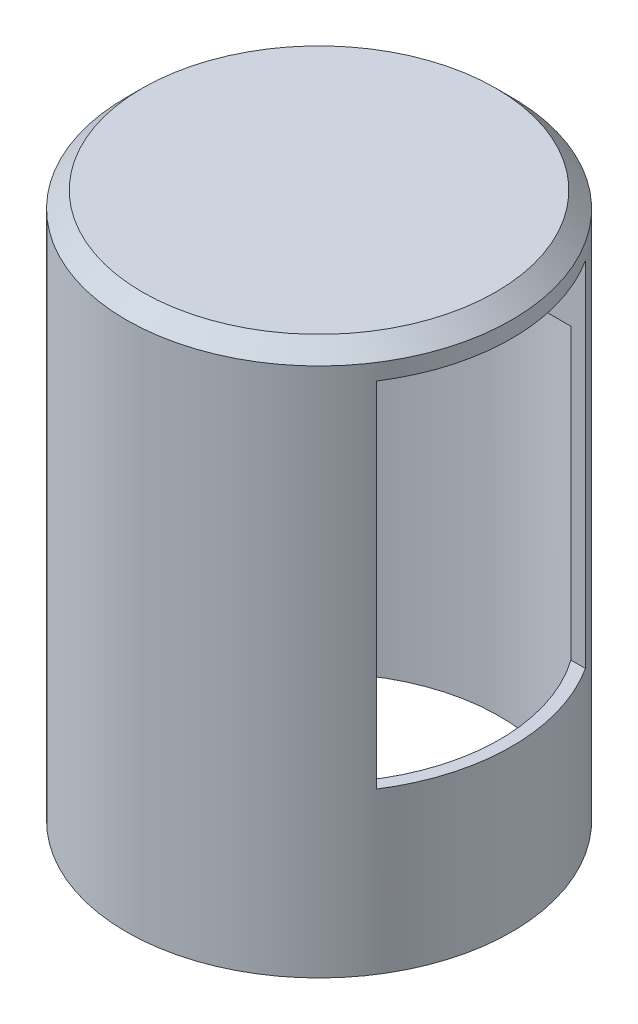
ISO-10303-21;
HEADER;
FILE_DESCRIPTION(('STEP AP214'),'2;1');
FILE_NAME('part.step','',(''),(''),'','','');
FILE_SCHEMA(('AUTOMOTIVE_DESIGN { 1 0 10303 214 1 1 1 1 }'));
ENDSEC;
DATA;
#1=APPLICATION_CONTEXT('core data for automotive mechanical design processes');
#2=APPLICATION_PROTOCOL_DEFINITION('international standard','automotive_design',2000,#1);
#3=PRODUCT_CONTEXT('',#1,'mechanical');
#4=PRODUCT('Part','Part','',(#3));
#5=PRODUCT_RELATED_PRODUCT_CATEGORY('part','',(#4));
#6=PRODUCT_DEFINITION_FORMATION('','',#4);
#7=PRODUCT_DEFINITION_CONTEXT('part definition',#1,'design');
#8=PRODUCT_DEFINITION('design','',#6,#7);
#9=PRODUCT_DEFINITION_SHAPE('','',#8);
#10=(LENGTH_UNIT() NAMED_UNIT(*) SI_UNIT(.MILLI.,.METRE.));
#11=(NAMED_UNIT(*) PLANE_ANGLE_UNIT() SI_UNIT($,.RADIAN.));
#12=(NAMED_UNIT(*) SI_UNIT($,.STERADIAN.) SOLID_ANGLE_UNIT());
#13=UNCERTAINTY_MEASURE_WITH_UNIT(LENGTH_MEASURE(1.E-05),#10,'distance_accuracy_value','');
#14=(GEOMETRIC_REPRESENTATION_CONTEXT(3) GLOBAL_UNCERTAINTY_ASSIGNED_CONTEXT((#13)) GLOBAL_UNIT_ASSIGNED_CONTEXT((#10,
#11,#12)) REPRESENTATION_CONTEXT('',''));
#15=CARTESIAN_POINT('',(0.,0.,0.));
#16=DIRECTION('',(0.,0.,1.));
#17=DIRECTION('',(1.,0.,0.));
#18=AXIS2_PLACEMENT_3D('',#15,#16,#17);
#19=CARTESIAN_POINT('',(0.,33.,0.));
#20=DIRECTION('',(0.,1.,0.));
#21=DIRECTION('',(0.,0.,1.));
#22=AXIS2_PLACEMENT_3D('',#19,#20,#21);
#23=PLANE('',#22);
#24=DIRECTION('',(1.,0.,0.));
#25=VECTOR('',#24,1.);
#26=CARTESIAN_POINT('',(0.,33.,-6.5));
#27=LINE('',#26,#25);
#28=CARTESIAN_POINT('',(7.00332808251502,33.,-6.5));
#29=VERTEX_POINT('',#28);
#30=CARTESIAN_POINT('',(9.18218383610348,33.,-6.5));
#31=VERTEX_POINT('',#30);
#32=EDGE_CURVE('E459',#29,#31,#27,.T.);
#33=ORIENTED_EDGE('',*,*,#32,.T.);
#34=CARTESIAN_POINT('',(0.,33.,0.));
#35=DIRECTION('',(0.,1.,0.));
#36=DIRECTION('',(0.,0.,1.));
#37=AXIS2_PLACEMENT_3D('',#34,#35,#36);
#38=CIRCLE('',#37,11.25);
#39=CARTESIAN_POINT('',(9.18218383610348,33.,6.5));
#40=VERTEX_POINT('',#39);
#41=EDGE_CURVE('E346',#40,#31,#38,.T.);
#42=ORIENTED_EDGE('',*,*,#41,.F.);
#43=DIRECTION('',(-1.,0.,0.));
#44=VECTOR('',#43,1.);
#45=CARTESIAN_POINT('',(0.,33.,6.5));
#46=LINE('',#45,#44);
#47=CARTESIAN_POINT('',(7.00332808251503,33.,6.5));
#48=VERTEX_POINT('',#47);
#49=EDGE_CURVE('E437',#40,#48,#46,.T.);
#50=ORIENTED_EDGE('',*,*,#49,.T.);
#51=DIRECTION('',(0.,0.,1.));
#52=VECTOR('',#51,1.);
#53=CARTESIAN_POINT('',(7.00332808251503,33.,0.));
#54=LINE('',#53,#52);
#55=CARTESIAN_POINT('',(7.00332808251503,33.,4.5));
#56=VERTEX_POINT('',#55);
#57=EDGE_CURVE('E271',#56,#48,#54,.T.);
#58=ORIENTED_EDGE('',*,*,#57,.F.);
#59=DIRECTION('',(1.,0.,0.));
#60=VECTOR('',#59,1.);
#61=CARTESIAN_POINT('',(0.,33.,4.5));
#62=LINE('',#61,#60);
#63=CARTESIAN_POINT('',(5.00332808251503,33.,4.5));
#64=VERTEX_POINT('',#63);
#65=EDGE_CURVE('E265',#64,#56,#62,.T.);
#66=ORIENTED_EDGE('',*,*,#65,.F.);
#67=DIRECTION('',(0.,0.,1.));
#68=VECTOR('',#67,1.);
#69=CARTESIAN_POINT('',(5.00332808251503,33.,0.));
#70=LINE('',#69,#68);
#71=CARTESIAN_POINT('',(5.00332808251503,33.,6.5));
#72=VERTEX_POINT('',#71);
#73=EDGE_CURVE('E267',#64,#72,#70,.T.);
#74=ORIENTED_EDGE('',*,*,#73,.T.);
#75=CARTESIAN_POINT('',(-4.15407654369154,33.,6.5));
#76=VERTEX_POINT('',#75);
#77=EDGE_CURVE('E439',#72,#76,#46,.T.);
#78=ORIENTED_EDGE('',*,*,#77,.T.);
#79=DIRECTION('',(0.,0.,1.));
#80=VECTOR('',#79,1.);
#81=CARTESIAN_POINT('',(-4.15407654369154,33.,0.));
#82=LINE('',#81,#80);
#83=CARTESIAN_POINT('',(-4.15407654369154,33.,4.5));
#84=VERTEX_POINT('',#83);
#85=EDGE_CURVE('E294',#84,#76,#82,.T.);
#86=ORIENTED_EDGE('',*,*,#85,.F.);
#87=DIRECTION('',(-1.,0.,0.));
#88=VECTOR('',#87,1.);
#89=CARTESIAN_POINT('',(0.,33.,4.5));
#90=LINE('',#89,#88);
#91=CARTESIAN_POINT('',(-6.15407654369153,33.,4.5));
#92=VERTEX_POINT('',#91);
#93=EDGE_CURVE('E297',#84,#92,#90,.T.);
#94=ORIENTED_EDGE('',*,*,#93,.T.);
#95=DIRECTION('',(0.,0.,1.));
#96=VECTOR('',#95,1.);
#97=CARTESIAN_POINT('',(-6.15407654369153,33.,0.));
#98=LINE('',#97,#96);
#99=CARTESIAN_POINT('',(-6.15407654369153,33.,6.5));
#100=VERTEX_POINT('',#99);
#101=EDGE_CURVE('E301',#92,#100,#98,.T.);
#102=ORIENTED_EDGE('',*,*,#101,.T.);
#103=CARTESIAN_POINT('',(-9.18218383610348,33.,6.5));
#104=VERTEX_POINT('',#103);
#105=EDGE_CURVE('E440',#100,#104,#46,.T.);
#106=ORIENTED_EDGE('',*,*,#105,.T.);
#107=CARTESIAN_POINT('',(-9.18218383610348,33.,-6.5));
#108=VERTEX_POINT('',#107);
#109=EDGE_CURVE('E350',#108,#104,#38,.T.);
#110=ORIENTED_EDGE('',*,*,#109,.F.);
#111=CARTESIAN_POINT('',(-6.15407654369154,33.,-6.5));
#112=VERTEX_POINT('',#111);
#113=EDGE_CURVE('E433',#108,#112,#27,.T.);
#114=ORIENTED_EDGE('',*,*,#113,.T.);
#115=DIRECTION('',(0.,0.,1.));
#116=VECTOR('',#115,1.);
#117=CARTESIAN_POINT('',(-6.15407654369154,33.,0.));
#118=LINE('',#117,#116);
#119=CARTESIAN_POINT('',(-6.15407654369154,33.,-4.5));
#120=VERTEX_POINT('',#119);
#121=EDGE_CURVE('E209',#112,#120,#118,.T.);
#122=ORIENTED_EDGE('',*,*,#121,.T.);
#123=DIRECTION('',(1.,0.,0.));
#124=VECTOR('',#123,1.);
#125=CARTESIAN_POINT('',(0.,33.,-4.5));
#126=LINE('',#125,#124);
#127=CARTESIAN_POINT('',(-4.15407654369154,33.,-4.5));
#128=VERTEX_POINT('',#127);
#129=EDGE_CURVE('E231',#120,#128,#126,.T.);
#130=ORIENTED_EDGE('',*,*,#129,.T.);
#131=DIRECTION('',(0.,0.,-1.));
#132=VECTOR('',#131,1.);
#133=CARTESIAN_POINT('',(-4.15407654369154,33.,0.));
#134=LINE('',#133,#132);
#135=CARTESIAN_POINT('',(-4.15407654369154,33.,-6.5));
#136=VERTEX_POINT('',#135);
#137=EDGE_CURVE('E227',#128,#136,#134,.T.);
#138=ORIENTED_EDGE('',*,*,#137,.T.);
#139=CARTESIAN_POINT('',(5.00332808251503,33.,-6.5));
#140=VERTEX_POINT('',#139);
#141=EDGE_CURVE('E456',#136,#140,#27,.T.);
#142=ORIENTED_EDGE('',*,*,#141,.T.);
#143=DIRECTION('',(0.,0.,-1.));
#144=VECTOR('',#143,1.);
#145=CARTESIAN_POINT('',(5.00332808251502,33.,0.));
#146=LINE('',#145,#144);
#147=CARTESIAN_POINT('',(5.00332808251502,33.,-4.5));
#148=VERTEX_POINT('',#147);
#149=EDGE_CURVE('E235',#148,#140,#146,.T.);
#150=ORIENTED_EDGE('',*,*,#149,.F.);
#151=DIRECTION('',(-1.,0.,0.));
#152=VECTOR('',#151,1.);
#153=CARTESIAN_POINT('',(0.,33.,-4.5));
#154=LINE('',#153,#152);
#155=CARTESIAN_POINT('',(7.00332808251502,33.,-4.5));
#156=VERTEX_POINT('',#155);
#157=EDGE_CURVE('E238',#156,#148,#154,.T.);
#158=ORIENTED_EDGE('',*,*,#157,.F.);
#159=DIRECTION('',(0.,0.,1.));
#160=VECTOR('',#159,1.);
#161=CARTESIAN_POINT('',(7.00332808251502,33.,0.));
#162=LINE('',#161,#160);
#163=EDGE_CURVE('E242',#29,#156,#162,.T.);
#164=ORIENTED_EDGE('',*,*,#163,.F.);
#165=EDGE_LOOP('',(#33,#42,#50,#58,#66,#74,#78,#86,#94,#102,#106,#110,#114,#122,#130,#138,#142,
#150,#158,#164));
#166=FACE_BOUND('',#165,.T.);
#167=ADVANCED_FACE('F35',(#166),#23,.F.);
#168=CARTESIAN_POINT('',(0.,33.,0.));
#169=DIRECTION('',(0.,-1.,0.));
#170=DIRECTION('',(0.,0.,-1.));
#171=AXIS2_PLACEMENT_3D('',#168,#169,#170);
#172=CYLINDRICAL_SURFACE('',#171,11.25);
#173=ORIENTED_EDGE('',*,*,#41,.T.);
#174=DIRECTION('',(0.,-1.,0.));
#175=VECTOR('',#174,1.);
#176=CARTESIAN_POINT('',(9.18218383610348,33.,-6.5));
#177=LINE('',#176,#175);
#178=CARTESIAN_POINT('',(9.18218383610348,32.,-6.5));
#179=VERTEX_POINT('',#178);
#180=EDGE_CURVE('E426',#31,#179,#177,.T.);
#181=ORIENTED_EDGE('',*,*,#180,.T.);
#182=CARTESIAN_POINT('',(0.,32.,0.));
#183=DIRECTION('',(0.,1.,0.));
#184=DIRECTION('',(0.,0.,1.));
#185=AXIS2_PLACEMENT_3D('',#182,#183,#184);
#186=CIRCLE('',#185,11.25);
#187=CARTESIAN_POINT('',(9.18218383610348,32.,6.5));
#188=VERTEX_POINT('',#187);
#189=EDGE_CURVE('E342',#188,#179,#186,.T.);
#190=ORIENTED_EDGE('',*,*,#189,.F.);
#191=DIRECTION('',(0.,-1.,0.));
#192=VECTOR('',#191,1.);
#193=CARTESIAN_POINT('',(9.18218383610348,33.,6.5));
#194=LINE('',#193,#192);
#195=EDGE_CURVE('E422',#40,#188,#194,.T.);
#196=ORIENTED_EDGE('',*,*,#195,.F.);
#197=EDGE_LOOP('',(#173,#181,#190,#196));
#198=FACE_BOUND('',#197,.T.);
#199=ADVANCED_FACE('F387',(#198),#172,.F.);
#200=CARTESIAN_POINT('',(0.,0.,0.));
#201=DIRECTION('',(0.,1.,0.));
#202=DIRECTION('',(0.,0.,1.));
#203=AXIS2_PLACEMENT_3D('',#200,#201,#202);
#204=CIRCLE('',#203,11.25);
#205=CARTESIAN_POINT('',(0.,0.,11.25));
#206=VERTEX_POINT('',#205);
#207=EDGE_CURVE('E353',#206,#206,#204,.T.);
#208=ORIENTED_EDGE('',*,*,#207,.F.);
#209=EDGE_LOOP('',(#208));
#210=FACE_BOUND('',#209,.T.);
#211=CARTESIAN_POINT('',(0.,28.,0.));
#212=DIRECTION('',(0.,1.,0.));
#213=DIRECTION('',(0.,0.,1.));
#214=AXIS2_PLACEMENT_3D('',#211,#212,#213);
#215=CIRCLE('',#214,11.25);
#216=CARTESIAN_POINT('',(9.18218383610348,28.,-6.5));
#217=VERTEX_POINT('',#216);
#218=CARTESIAN_POINT('',(-9.18218383610348,28.,-6.5));
#219=VERTEX_POINT('',#218);
#220=EDGE_CURVE('E50',#217,#219,#215,.T.);
#221=ORIENTED_EDGE('',*,*,#220,.T.);
#222=DIRECTION('',(0.,-1.,0.));
#223=VECTOR('',#222,1.);
#224=CARTESIAN_POINT('',(-9.18218383610348,33.,-6.5));
#225=LINE('',#224,#223);
#226=EDGE_CURVE('E54',#108,#219,#225,.T.);
#227=ORIENTED_EDGE('',*,*,#226,.F.);
#228=ORIENTED_EDGE('',*,*,#109,.T.);
#229=DIRECTION('',(0.,-1.,0.));
#230=VECTOR('',#229,1.);
#231=CARTESIAN_POINT('',(-9.18218383610348,33.,6.5));
#232=LINE('',#231,#230);
#233=CARTESIAN_POINT('',(-9.18218383610348,28.,6.5));
#234=VERTEX_POINT('',#233);
#235=EDGE_CURVE('E222',#104,#234,#232,.T.);
#236=ORIENTED_EDGE('',*,*,#235,.T.);
#237=CARTESIAN_POINT('',(0.,28.,0.));
#238=DIRECTION('',(0.,1.,0.));
#239=DIRECTION('',(0.,0.,1.));
#240=AXIS2_PLACEMENT_3D('',#237,#238,#239);
#241=CIRCLE('',#240,11.25);
#242=CARTESIAN_POINT('',(9.18218383610348,28.,6.5));
#243=VERTEX_POINT('',#242);
#244=EDGE_CURVE('E431',#234,#243,#241,.T.);
#245=ORIENTED_EDGE('',*,*,#244,.T.);
#246=DIRECTION('',(0.,-1.,0.));
#247=VECTOR('',#246,1.);
#248=CARTESIAN_POINT('',(9.18218383610348,33.,6.5));
#249=LINE('',#248,#247);
#250=CARTESIAN_POINT('',(9.18218383610348,10.,6.5));
#251=VERTEX_POINT('',#250);
#252=EDGE_CURVE('E358',#243,#251,#249,.T.);
#253=ORIENTED_EDGE('',*,*,#252,.T.);
#254=CARTESIAN_POINT('',(0.,10.,0.));
#255=DIRECTION('',(0.,1.,0.));
#256=DIRECTION('',(0.,0.,1.));
#257=AXIS2_PLACEMENT_3D('',#254,#255,#256);
#258=CIRCLE('',#257,11.25);
#259=CARTESIAN_POINT('',(9.18218383610348,10.,-6.5));
#260=VERTEX_POINT('',#259);
#261=EDGE_CURVE('E331',#251,#260,#258,.T.);
#262=ORIENTED_EDGE('',*,*,#261,.T.);
#263=DIRECTION('',(0.,-1.,0.));
#264=VECTOR('',#263,1.);
#265=CARTESIAN_POINT('',(9.18218383610348,33.,-6.5));
#266=LINE('',#265,#264);
#267=EDGE_CURVE('E356',#217,#260,#266,.T.);
#268=ORIENTED_EDGE('',*,*,#267,.F.);
#269=EDGE_LOOP('',(#221,#227,#228,#236,#245,#253,#262,#268));
#270=FACE_BOUND('',#269,.T.);
#271=ADVANCED_FACE('F393',(#210,#270),#172,.F.);
#272=CARTESIAN_POINT('',(0.,33.,6.5));
#273=DIRECTION('',(0.,0.,1.));
#274=DIRECTION('',(1.,0.,0.));
#275=AXIS2_PLACEMENT_3D('',#272,#273,#274);
#276=PLANE('',#275);
#277=DIRECTION('',(0.,-1.,0.));
#278=VECTOR('',#277,1.);
#279=CARTESIAN_POINT('',(10.087120500916,33.,6.5));
#280=LINE('',#279,#278);
#281=CARTESIAN_POINT('',(10.087120500916,32.,6.5));
#282=VERTEX_POINT('',#281);
#283=CARTESIAN_POINT('',(10.087120500916,10.,6.5));
#284=VERTEX_POINT('',#283);
#285=EDGE_CURVE('E360',#282,#284,#280,.T.);
#286=ORIENTED_EDGE('',*,*,#285,.T.);
#287=DIRECTION('',(-1.,0.,0.));
#288=VECTOR('',#287,1.);
#289=CARTESIAN_POINT('',(0.,10.,6.5));
#290=LINE('',#289,#288);
#291=EDGE_CURVE('E323',#284,#251,#290,.T.);
#292=ORIENTED_EDGE('',*,*,#291,.T.);
#293=ORIENTED_EDGE('',*,*,#252,.F.);
#294=DIRECTION('',(-1.,0.,0.));
#295=VECTOR('',#294,1.);
#296=CARTESIAN_POINT('',(0.,28.,6.5));
#297=LINE('',#296,#295);
#298=EDGE_CURVE('E428',#243,#234,#297,.T.);
#299=ORIENTED_EDGE('',*,*,#298,.T.);
#300=ORIENTED_EDGE('',*,*,#235,.F.);
#301=ORIENTED_EDGE('',*,*,#105,.F.);
#302=DIRECTION('',(0.,-1.,0.));
#303=VECTOR('',#302,1.);
#304=CARTESIAN_POINT('',(-6.15407654369153,33.,6.5));
#305=LINE('',#304,#303);
#306=CARTESIAN_POINT('',(-6.15407654369153,29.,6.5));
#307=VERTEX_POINT('',#306);
#308=EDGE_CURVE('E316',#100,#307,#305,.T.);
#309=ORIENTED_EDGE('',*,*,#308,.T.);
#310=DIRECTION('',(-1.,0.,0.));
#311=VECTOR('',#310,1.);
#312=CARTESIAN_POINT('',(0.,29.,6.5));
#313=LINE('',#312,#311);
#314=CARTESIAN_POINT('',(-4.15407654369154,29.,6.5));
#315=VERTEX_POINT('',#314);
#316=EDGE_CURVE('E298',#315,#307,#313,.T.);
#317=ORIENTED_EDGE('',*,*,#316,.F.);
#318=DIRECTION('',(0.,-1.,0.));
#319=VECTOR('',#318,1.);
#320=CARTESIAN_POINT('',(-4.15407654369154,33.,6.5));
#321=LINE('',#320,#319);
#322=EDGE_CURVE('E304',#76,#315,#321,.T.);
#323=ORIENTED_EDGE('',*,*,#322,.F.);
#324=ORIENTED_EDGE('',*,*,#77,.F.);
#325=DIRECTION('',(0.,-1.,0.));
#326=VECTOR('',#325,1.);
#327=CARTESIAN_POINT('',(5.00332808251503,33.,6.5));
#328=LINE('',#327,#326);
#329=CARTESIAN_POINT('',(5.00332808251503,29.,6.5));
#330=VERTEX_POINT('',#329);
#331=EDGE_CURVE('E289',#72,#330,#328,.T.);
#332=ORIENTED_EDGE('',*,*,#331,.T.);
#333=DIRECTION('',(-1.,0.,0.));
#334=VECTOR('',#333,1.);
#335=CARTESIAN_POINT('',(0.,29.,6.5));
#336=LINE('',#335,#334);
#337=CARTESIAN_POINT('',(7.00332808251503,29.,6.5));
#338=VERTEX_POINT('',#337);
#339=EDGE_CURVE('E280',#338,#330,#336,.T.);
#340=ORIENTED_EDGE('',*,*,#339,.F.);
#341=DIRECTION('',(0.,-1.,0.));
#342=VECTOR('',#341,1.);
#343=CARTESIAN_POINT('',(7.00332808251503,33.,6.5));
#344=LINE('',#343,#342);
#345=EDGE_CURVE('E286',#48,#338,#344,.T.);
#346=ORIENTED_EDGE('',*,*,#345,.F.);
#347=ORIENTED_EDGE('',*,*,#49,.F.);
#348=ORIENTED_EDGE('',*,*,#195,.T.);
#349=DIRECTION('',(-1.,0.,0.));
#350=VECTOR('',#349,1.);
#351=CARTESIAN_POINT('',(0.,32.,6.5));
#352=LINE('',#351,#350);
#353=EDGE_CURVE('E334',#282,#188,#352,.T.);
#354=ORIENTED_EDGE('',*,*,#353,.F.);
#355=EDGE_LOOP('',(#286,#292,#293,#299,#300,#301,#309,#317,#323,#324,#332,#340,#346,#347,#348,#354));
#356=FACE_BOUND('',#355,.T.);
#357=ADVANCED_FACE('F404',(#356),#276,.F.);
#358=CARTESIAN_POINT('',(0.,33.,-6.5));
#359=DIRECTION('',(0.,0.,-1.));
#360=DIRECTION('',(-1.,0.,0.));
#361=AXIS2_PLACEMENT_3D('',#358,#359,#360);
#362=PLANE('',#361);
#363=DIRECTION('',(1.,0.,0.));
#364=VECTOR('',#363,1.);
#365=CARTESIAN_POINT('',(0.,32.,-6.5));
#366=LINE('',#365,#364);
#367=CARTESIAN_POINT('',(10.087120500916,32.,-6.5));
#368=VERTEX_POINT('',#367);
#369=EDGE_CURVE('E339',#179,#368,#366,.T.);
#370=ORIENTED_EDGE('',*,*,#369,.F.);
#371=ORIENTED_EDGE('',*,*,#180,.F.);
#372=ORIENTED_EDGE('',*,*,#32,.F.);
#373=DIRECTION('',(0.,-1.,0.));
#374=VECTOR('',#373,1.);
#375=CARTESIAN_POINT('',(7.00332808251502,33.,-6.5));
#376=LINE('',#375,#374);
#377=CARTESIAN_POINT('',(7.00332808251502,29.,-6.5));
#378=VERTEX_POINT('',#377);
#379=EDGE_CURVE('E257',#29,#378,#376,.T.);
#380=ORIENTED_EDGE('',*,*,#379,.T.);
#381=DIRECTION('',(1.,0.,0.));
#382=VECTOR('',#381,1.);
#383=CARTESIAN_POINT('',(0.,29.,-6.5));
#384=LINE('',#383,#382);
#385=CARTESIAN_POINT('',(5.00332808251503,29.,-6.5));
#386=VERTEX_POINT('',#385);
#387=EDGE_CURVE('E239',#386,#378,#384,.T.);
#388=ORIENTED_EDGE('',*,*,#387,.F.);
#389=DIRECTION('',(0.,-1.,0.));
#390=VECTOR('',#389,1.);
#391=CARTESIAN_POINT('',(5.00332808251503,33.,-6.5));
#392=LINE('',#391,#390);
#393=EDGE_CURVE('E245',#140,#386,#392,.T.);
#394=ORIENTED_EDGE('',*,*,#393,.F.);
#395=ORIENTED_EDGE('',*,*,#141,.F.);
#396=DIRECTION('',(0.,-1.,0.));
#397=VECTOR('',#396,1.);
#398=CARTESIAN_POINT('',(-4.15407654369154,33.,-6.5));
#399=LINE('',#398,#397);
#400=CARTESIAN_POINT('',(-4.15407654369154,29.,-6.5));
#401=VERTEX_POINT('',#400);
#402=EDGE_CURVE('E212',#136,#401,#399,.T.);
#403=ORIENTED_EDGE('',*,*,#402,.T.);
#404=DIRECTION('',(-1.,0.,0.));
#405=VECTOR('',#404,1.);
#406=CARTESIAN_POINT('',(0.,29.,-6.5));
#407=LINE('',#406,#405);
#408=CARTESIAN_POINT('',(-6.15407654369154,29.,-6.5));
#409=VERTEX_POINT('',#408);
#410=EDGE_CURVE('E198',#401,#409,#407,.T.);
#411=ORIENTED_EDGE('',*,*,#410,.T.);
#412=DIRECTION('',(0.,-1.,0.));
#413=VECTOR('',#412,1.);
#414=CARTESIAN_POINT('',(-6.15407654369154,33.,-6.5));
#415=LINE('',#414,#413);
#416=EDGE_CURVE('E207',#112,#409,#415,.T.);
#417=ORIENTED_EDGE('',*,*,#416,.F.);
#418=ORIENTED_EDGE('',*,*,#113,.F.);
#419=ORIENTED_EDGE('',*,*,#226,.T.);
#420=DIRECTION('',(1.,0.,0.));
#421=VECTOR('',#420,1.);
#422=CARTESIAN_POINT('',(0.,28.,-6.5));
#423=LINE('',#422,#421);
#424=EDGE_CURVE('E462',#219,#217,#423,.T.);
#425=ORIENTED_EDGE('',*,*,#424,.T.);
#426=ORIENTED_EDGE('',*,*,#267,.T.);
#427=DIRECTION('',(1.,0.,0.));
#428=VECTOR('',#427,1.);
#429=CARTESIAN_POINT('',(0.,10.,-6.5));
#430=LINE('',#429,#428);
#431=CARTESIAN_POINT('',(10.087120500916,10.,-6.5));
#432=VERTEX_POINT('',#431);
#433=EDGE_CURVE('E329',#260,#432,#430,.T.);
#434=ORIENTED_EDGE('',*,*,#433,.T.);
#435=DIRECTION('',(0.,-1.,0.));
#436=VECTOR('',#435,1.);
#437=CARTESIAN_POINT('',(10.087120500916,33.,-6.5));
#438=LINE('',#437,#436);
#439=EDGE_CURVE('E349',#368,#432,#438,.T.);
#440=ORIENTED_EDGE('',*,*,#439,.F.);
#441=EDGE_LOOP('',(#370,#371,#372,#380,#388,#394,#395,#403,#411,#417,#418,#419,#425,#426,#434,#440));
#442=FACE_BOUND('',#441,.T.);
#443=ADVANCED_FACE('F217',(#442),#362,.F.);
#444=CARTESIAN_POINT('',(0.,33.,0.));
#445=DIRECTION('',(0.,-1.,0.));
#446=DIRECTION('',(0.,0.,-1.));
#447=AXIS2_PLACEMENT_3D('',#444,#445,#446);
#448=CYLINDRICAL_SURFACE('',#447,12.);
#449=CARTESIAN_POINT('',(0.,0.,0.));
#450=DIRECTION('',(0.,1.,0.));
#451=DIRECTION('',(0.,0.,1.));
#452=AXIS2_PLACEMENT_3D('',#449,#450,#451);
#453=CIRCLE('',#452,12.);
#454=CARTESIAN_POINT('',(0.,0.,12.));
#455=VERTEX_POINT('',#454);
#456=EDGE_CURVE('E345',#455,#455,#453,.T.);
#457=ORIENTED_EDGE('',*,*,#456,.T.);
#458=EDGE_LOOP('',(#457));
#459=FACE_BOUND('',#458,.T.);
#460=CARTESIAN_POINT('',(0.,33.,0.));
#461=DIRECTION('',(0.,1.,0.));
#462=DIRECTION('',(0.,0.,1.));
#463=AXIS2_PLACEMENT_3D('',#460,#461,#462);
#464=CIRCLE('',#463,12.);
#465=CARTESIAN_POINT('',(0.,33.,12.));
#466=VERTEX_POINT('',#465);
#467=EDGE_CURVE('E11',#466,#466,#464,.F.);
#468=ORIENTED_EDGE('',*,*,#467,.T.);
#469=EDGE_LOOP('',(#468));
#470=FACE_BOUND('',#469,.T.);
#471=ORIENTED_EDGE('',*,*,#285,.F.);
#472=CARTESIAN_POINT('',(0.,32.,0.));
#473=DIRECTION('',(0.,1.,0.));
#474=DIRECTION('',(0.,0.,1.));
#475=AXIS2_PLACEMENT_3D('',#472,#473,#474);
#476=CIRCLE('',#475,12.);
#477=EDGE_CURVE('E337',#282,#368,#476,.T.);
#478=ORIENTED_EDGE('',*,*,#477,.T.);
#479=ORIENTED_EDGE('',*,*,#439,.T.);
#480=CARTESIAN_POINT('',(0.,10.,0.));
#481=DIRECTION('',(0.,1.,0.));
#482=DIRECTION('',(0.,0.,1.));
#483=AXIS2_PLACEMENT_3D('',#480,#481,#482);
#484=CIRCLE('',#483,12.);
#485=EDGE_CURVE('E326',#284,#432,#484,.T.);
#486=ORIENTED_EDGE('',*,*,#485,.F.);
#487=EDGE_LOOP('',(#471,#478,#479,#486));
#488=FACE_BOUND('',#487,.T.);
#489=ADVANCED_FACE('F401',(#459,#470,#488),#448,.T.);
#490=CARTESIAN_POINT('',(0.,0.,0.));
#491=DIRECTION('',(0.,1.,0.));
#492=DIRECTION('',(0.,0.,1.));
#493=AXIS2_PLACEMENT_3D('',#490,#491,#492);
#494=PLANE('',#493);
#495=ORIENTED_EDGE('',*,*,#207,.T.);
#496=EDGE_LOOP('',(#495));
#497=FACE_BOUND('',#496,.T.);
#498=ORIENTED_EDGE('',*,*,#456,.F.);
#499=EDGE_LOOP('',(#498));
#500=FACE_BOUND('',#499,.T.);
#501=ADVANCED_FACE('F398',(#497,#500),#494,.F.);
#502=CARTESIAN_POINT('',(0.,34.,0.));
#503=DIRECTION('',(0.,1.,0.));
#504=DIRECTION('',(0.,0.,1.));
#505=AXIS2_PLACEMENT_3D('',#502,#503,#504);
#506=PLANE('',#505);
#507=CARTESIAN_POINT('',(0.,34.,0.));
#508=DIRECTION('',(0.,1.,0.));
#509=DIRECTION('',(0.,0.,1.));
#510=AXIS2_PLACEMENT_3D('',#507,#508,#509);
#511=CIRCLE('',#510,11.);
#512=CARTESIAN_POINT('',(0.,34.,11.));
#513=VERTEX_POINT('',#512);
#514=EDGE_CURVE('E43',#513,#513,#511,.T.);
#515=ORIENTED_EDGE('',*,*,#514,.T.);
#516=EDGE_LOOP('',(#515));
#517=FACE_BOUND('',#516,.T.);
#518=ADVANCED_FACE('F370',(#517),#506,.T.);
#519=CARTESIAN_POINT('',(0.,32.,0.));
#520=DIRECTION('',(0.,1.,0.));
#521=DIRECTION('',(0.,0.,1.));
#522=AXIS2_PLACEMENT_3D('',#519,#520,#521);
#523=PLANE('',#522);
#524=ORIENTED_EDGE('',*,*,#353,.T.);
#525=ORIENTED_EDGE('',*,*,#189,.T.);
#526=ORIENTED_EDGE('',*,*,#369,.T.);
#527=ORIENTED_EDGE('',*,*,#477,.F.);
#528=EDGE_LOOP('',(#524,#525,#526,#527));
#529=FACE_BOUND('',#528,.T.);
#530=ADVANCED_FACE('F374',(#529),#523,.F.);
#531=CARTESIAN_POINT('',(0.,34.,0.));
#532=DIRECTION('',(0.,-1.,0.));
#533=DIRECTION('',(0.,0.,-1.));
#534=AXIS2_PLACEMENT_3D('',#531,#532,#533);
#535=CONICAL_SURFACE('',#534,11.,0.785398163397447);
#536=ORIENTED_EDGE('',*,*,#467,.F.);
#537=EDGE_LOOP('',(#536));
#538=FACE_BOUND('',#537,.T.);
#539=ORIENTED_EDGE('',*,*,#514,.F.);
#540=EDGE_LOOP('',(#539));
#541=FACE_BOUND('',#540,.T.);
#542=ADVANCED_FACE('F37',(#538,#541),#535,.T.);
#543=CARTESIAN_POINT('',(0.,10.,0.));
#544=DIRECTION('',(0.,1.,0.));
#545=DIRECTION('',(0.,0.,1.));
#546=AXIS2_PLACEMENT_3D('',#543,#544,#545);
#547=PLANE('',#546);
#548=ORIENTED_EDGE('',*,*,#291,.F.);
#549=ORIENTED_EDGE('',*,*,#485,.T.);
#550=ORIENTED_EDGE('',*,*,#433,.F.);
#551=ORIENTED_EDGE('',*,*,#261,.F.);
#552=EDGE_LOOP('',(#548,#549,#550,#551));
#553=FACE_BOUND('',#552,.T.);
#554=ADVANCED_FACE('F373',(#553),#547,.T.);
#555=CARTESIAN_POINT('',(-4.15407654369154,33.,0.));
#556=DIRECTION('',(1.,0.,0.));
#557=DIRECTION('',(0.,0.,-1.));
#558=AXIS2_PLACEMENT_3D('',#555,#556,#557);
#559=PLANE('',#558);
#560=DIRECTION('',(0.,0.,1.));
#561=VECTOR('',#560,1.);
#562=CARTESIAN_POINT('',(-4.15407654369154,29.,0.));
#563=LINE('',#562,#561);
#564=CARTESIAN_POINT('',(-4.15407654369154,29.,4.5));
#565=VERTEX_POINT('',#564);
#566=EDGE_CURVE('E293',#565,#315,#563,.T.);
#567=ORIENTED_EDGE('',*,*,#566,.F.);
#568=DIRECTION('',(0.,-1.,0.));
#569=VECTOR('',#568,1.);
#570=CARTESIAN_POINT('',(-4.15407654369154,33.,4.5));
#571=LINE('',#570,#569);
#572=EDGE_CURVE('E321',#84,#565,#571,.T.);
#573=ORIENTED_EDGE('',*,*,#572,.F.);
#574=ORIENTED_EDGE('',*,*,#85,.T.);
#575=ORIENTED_EDGE('',*,*,#322,.T.);
#576=EDGE_LOOP('',(#567,#573,#574,#575));
#577=FACE_BOUND('',#576,.T.);
#578=ADVANCED_FACE('F380',(#577),#559,.T.);
#579=CARTESIAN_POINT('',(0.,33.,4.5));
#580=DIRECTION('',(0.,0.,1.));
#581=DIRECTION('',(1.,0.,0.));
#582=AXIS2_PLACEMENT_3D('',#579,#580,#581);
#583=PLANE('',#582);
#584=DIRECTION('',(-1.,0.,0.));
#585=VECTOR('',#584,1.);
#586=CARTESIAN_POINT('',(0.,29.,4.5));
#587=LINE('',#586,#585);
#588=CARTESIAN_POINT('',(-6.15407654369153,29.,4.5));
#589=VERTEX_POINT('',#588);
#590=EDGE_CURVE('E307',#565,#589,#587,.T.);
#591=ORIENTED_EDGE('',*,*,#590,.T.);
#592=DIRECTION('',(0.,-1.,0.));
#593=VECTOR('',#592,1.);
#594=CARTESIAN_POINT('',(-6.15407654369153,33.,4.5));
#595=LINE('',#594,#593);
#596=EDGE_CURVE('E318',#92,#589,#595,.T.);
#597=ORIENTED_EDGE('',*,*,#596,.F.);
#598=ORIENTED_EDGE('',*,*,#93,.F.);
#599=ORIENTED_EDGE('',*,*,#572,.T.);
#600=EDGE_LOOP('',(#591,#597,#598,#599));
#601=FACE_BOUND('',#600,.T.);
#602=ADVANCED_FACE('F524',(#601),#583,.F.);
#603=CARTESIAN_POINT('',(-6.15407654369153,33.,0.));
#604=DIRECTION('',(1.,0.,0.));
#605=DIRECTION('',(0.,0.,-1.));
#606=AXIS2_PLACEMENT_3D('',#603,#604,#605);
#607=PLANE('',#606);
#608=DIRECTION('',(0.,0.,1.));
#609=VECTOR('',#608,1.);
#610=CARTESIAN_POINT('',(-6.15407654369153,29.,0.));
#611=LINE('',#610,#609);
#612=EDGE_CURVE('E309',#589,#307,#611,.T.);
#613=ORIENTED_EDGE('',*,*,#612,.T.);
#614=ORIENTED_EDGE('',*,*,#308,.F.);
#615=ORIENTED_EDGE('',*,*,#101,.F.);
#616=ORIENTED_EDGE('',*,*,#596,.T.);
#617=EDGE_LOOP('',(#613,#614,#615,#616));
#618=FACE_BOUND('',#617,.T.);
#619=ADVANCED_FACE('F520',(#618),#607,.F.);
#620=CARTESIAN_POINT('',(0.,29.,0.));
#621=DIRECTION('',(0.,1.,0.));
#622=DIRECTION('',(0.,0.,1.));
#623=AXIS2_PLACEMENT_3D('',#620,#621,#622);
#624=PLANE('',#623);
#625=ORIENTED_EDGE('',*,*,#566,.T.);
#626=ORIENTED_EDGE('',*,*,#316,.T.);
#627=ORIENTED_EDGE('',*,*,#612,.F.);
#628=ORIENTED_EDGE('',*,*,#590,.F.);
#629=EDGE_LOOP('',(#625,#626,#627,#628));
#630=FACE_BOUND('',#629,.T.);
#631=ADVANCED_FACE('F516',(#630),#624,.F.);
#632=CARTESIAN_POINT('',(0.,33.,4.5));
#633=DIRECTION('',(0.,0.,-1.));
#634=DIRECTION('',(-1.,0.,0.));
#635=AXIS2_PLACEMENT_3D('',#632,#633,#634);
#636=PLANE('',#635);
#637=DIRECTION('',(1.,0.,0.));
#638=VECTOR('',#637,1.);
#639=CARTESIAN_POINT('',(0.,29.,4.5));
#640=LINE('',#639,#638);
#641=CARTESIAN_POINT('',(5.00332808251503,29.,4.5));
#642=VERTEX_POINT('',#641);
#643=CARTESIAN_POINT('',(7.00332808251503,29.,4.5));
#644=VERTEX_POINT('',#643);
#645=EDGE_CURVE('E264',#642,#644,#640,.T.);
#646=ORIENTED_EDGE('',*,*,#645,.F.);
#647=DIRECTION('',(0.,-1.,0.));
#648=VECTOR('',#647,1.);
#649=CARTESIAN_POINT('',(5.00332808251503,33.,4.5));
#650=LINE('',#649,#648);
#651=EDGE_CURVE('E291',#64,#642,#650,.T.);
#652=ORIENTED_EDGE('',*,*,#651,.F.);
#653=ORIENTED_EDGE('',*,*,#65,.T.);
#654=DIRECTION('',(0.,-1.,0.));
#655=VECTOR('',#654,1.);
#656=CARTESIAN_POINT('',(7.00332808251503,33.,4.5));
#657=LINE('',#656,#655);
#658=EDGE_CURVE('E274',#56,#644,#657,.T.);
#659=ORIENTED_EDGE('',*,*,#658,.T.);
#660=EDGE_LOOP('',(#646,#652,#653,#659));
#661=FACE_BOUND('',#660,.T.);
#662=ADVANCED_FACE('F512',(#661),#636,.T.);
#663=CARTESIAN_POINT('',(5.00332808251503,33.,0.));
#664=DIRECTION('',(1.,0.,0.));
#665=DIRECTION('',(0.,0.,-1.));
#666=AXIS2_PLACEMENT_3D('',#663,#664,#665);
#667=PLANE('',#666);
#668=DIRECTION('',(0.,0.,1.));
#669=VECTOR('',#668,1.);
#670=CARTESIAN_POINT('',(5.00332808251503,29.,0.));
#671=LINE('',#670,#669);
#672=EDGE_CURVE('E277',#642,#330,#671,.T.);
#673=ORIENTED_EDGE('',*,*,#672,.T.);
#674=ORIENTED_EDGE('',*,*,#331,.F.);
#675=ORIENTED_EDGE('',*,*,#73,.F.);
#676=ORIENTED_EDGE('',*,*,#651,.T.);
#677=EDGE_LOOP('',(#673,#674,#675,#676));
#678=FACE_BOUND('',#677,.T.);
#679=ADVANCED_FACE('F508',(#678),#667,.F.);
#680=CARTESIAN_POINT('',(7.00332808251503,33.,0.));
#681=DIRECTION('',(1.,0.,0.));
#682=DIRECTION('',(0.,0.,-1.));
#683=AXIS2_PLACEMENT_3D('',#680,#681,#682);
#684=PLANE('',#683);
#685=DIRECTION('',(0.,0.,1.));
#686=VECTOR('',#685,1.);
#687=CARTESIAN_POINT('',(7.00332808251503,29.,0.));
#688=LINE('',#687,#686);
#689=EDGE_CURVE('E268',#644,#338,#688,.T.);
#690=ORIENTED_EDGE('',*,*,#689,.F.);
#691=ORIENTED_EDGE('',*,*,#658,.F.);
#692=ORIENTED_EDGE('',*,*,#57,.T.);
#693=ORIENTED_EDGE('',*,*,#345,.T.);
#694=EDGE_LOOP('',(#690,#691,#692,#693));
#695=FACE_BOUND('',#694,.T.);
#696=ADVANCED_FACE('F504',(#695),#684,.T.);
#697=CARTESIAN_POINT('',(0.,29.,0.));
#698=DIRECTION('',(0.,1.,0.));
#699=DIRECTION('',(0.,0.,1.));
#700=AXIS2_PLACEMENT_3D('',#697,#698,#699);
#701=PLANE('',#700);
#702=ORIENTED_EDGE('',*,*,#645,.T.);
#703=ORIENTED_EDGE('',*,*,#689,.T.);
#704=ORIENTED_EDGE('',*,*,#339,.T.);
#705=ORIENTED_EDGE('',*,*,#672,.F.);
#706=EDGE_LOOP('',(#702,#703,#704,#705));
#707=FACE_BOUND('',#706,.T.);
#708=ADVANCED_FACE('F500',(#707),#701,.F.);
#709=CARTESIAN_POINT('',(5.00332808251502,33.,0.));
#710=DIRECTION('',(-1.,0.,0.));
#711=DIRECTION('',(0.,0.,1.));
#712=AXIS2_PLACEMENT_3D('',#709,#710,#711);
#713=PLANE('',#712);
#714=DIRECTION('',(0.,0.,-1.));
#715=VECTOR('',#714,1.);
#716=CARTESIAN_POINT('',(5.00332808251502,29.,0.));
#717=LINE('',#716,#715);
#718=CARTESIAN_POINT('',(5.00332808251502,29.,-4.5));
#719=VERTEX_POINT('',#718);
#720=EDGE_CURVE('E234',#719,#386,#717,.T.);
#721=ORIENTED_EDGE('',*,*,#720,.F.);
#722=DIRECTION('',(0.,-1.,0.));
#723=VECTOR('',#722,1.);
#724=CARTESIAN_POINT('',(5.00332808251502,33.,-4.5));
#725=LINE('',#724,#723);
#726=EDGE_CURVE('E262',#148,#719,#725,.T.);
#727=ORIENTED_EDGE('',*,*,#726,.F.);
#728=ORIENTED_EDGE('',*,*,#149,.T.);
#729=ORIENTED_EDGE('',*,*,#393,.T.);
#730=EDGE_LOOP('',(#721,#727,#728,#729));
#731=FACE_BOUND('',#730,.T.);
#732=ADVANCED_FACE('F496',(#731),#713,.T.);
#733=CARTESIAN_POINT('',(0.,33.,-4.5));
#734=DIRECTION('',(0.,0.,1.));
#735=DIRECTION('',(1.,0.,0.));
#736=AXIS2_PLACEMENT_3D('',#733,#734,#735);
#737=PLANE('',#736);
#738=DIRECTION('',(-1.,0.,0.));
#739=VECTOR('',#738,1.);
#740=CARTESIAN_POINT('',(0.,29.,-4.5));
#741=LINE('',#740,#739);
#742=CARTESIAN_POINT('',(7.00332808251502,29.,-4.5));
#743=VERTEX_POINT('',#742);
#744=EDGE_CURVE('E248',#743,#719,#741,.T.);
#745=ORIENTED_EDGE('',*,*,#744,.F.);
#746=DIRECTION('',(0.,-1.,0.));
#747=VECTOR('',#746,1.);
#748=CARTESIAN_POINT('',(7.00332808251502,33.,-4.5));
#749=LINE('',#748,#747);
#750=EDGE_CURVE('E260',#156,#743,#749,.T.);
#751=ORIENTED_EDGE('',*,*,#750,.F.);
#752=ORIENTED_EDGE('',*,*,#157,.T.);
#753=ORIENTED_EDGE('',*,*,#726,.T.);
#754=EDGE_LOOP('',(#745,#751,#752,#753));
#755=FACE_BOUND('',#754,.T.);
#756=ADVANCED_FACE('F492',(#755),#737,.T.);
#757=CARTESIAN_POINT('',(7.00332808251502,33.,0.));
#758=DIRECTION('',(1.,0.,0.));
#759=DIRECTION('',(0.,0.,-1.));
#760=AXIS2_PLACEMENT_3D('',#757,#758,#759);
#761=PLANE('',#760);
#762=DIRECTION('',(0.,0.,1.));
#763=VECTOR('',#762,1.);
#764=CARTESIAN_POINT('',(7.00332808251502,29.,0.));
#765=LINE('',#764,#763);
#766=EDGE_CURVE('E251',#378,#743,#765,.T.);
#767=ORIENTED_EDGE('',*,*,#766,.F.);
#768=ORIENTED_EDGE('',*,*,#379,.F.);
#769=ORIENTED_EDGE('',*,*,#163,.T.);
#770=ORIENTED_EDGE('',*,*,#750,.T.);
#771=EDGE_LOOP('',(#767,#768,#769,#770));
#772=FACE_BOUND('',#771,.T.);
#773=ADVANCED_FACE('F488',(#772),#761,.T.);
#774=CARTESIAN_POINT('',(0.,29.,0.));
#775=DIRECTION('',(0.,1.,0.));
#776=DIRECTION('',(0.,0.,1.));
#777=AXIS2_PLACEMENT_3D('',#774,#775,#776);
#778=PLANE('',#777);
#779=ORIENTED_EDGE('',*,*,#720,.T.);
#780=ORIENTED_EDGE('',*,*,#387,.T.);
#781=ORIENTED_EDGE('',*,*,#766,.T.);
#782=ORIENTED_EDGE('',*,*,#744,.T.);
#783=EDGE_LOOP('',(#779,#780,#781,#782));
#784=FACE_BOUND('',#783,.T.);
#785=ADVANCED_FACE('F485',(#784),#778,.F.);
#786=CARTESIAN_POINT('',(-4.15407654369154,33.,0.));
#787=DIRECTION('',(-1.,0.,0.));
#788=DIRECTION('',(0.,0.,1.));
#789=AXIS2_PLACEMENT_3D('',#786,#787,#788);
#790=PLANE('',#789);
#791=DIRECTION('',(0.,0.,-1.));
#792=VECTOR('',#791,1.);
#793=CARTESIAN_POINT('',(-4.15407654369154,29.,0.));
#794=LINE('',#793,#792);
#795=CARTESIAN_POINT('',(-4.15407654369154,29.,-4.5));
#796=VERTEX_POINT('',#795);
#797=EDGE_CURVE('E220',#796,#401,#794,.T.);
#798=ORIENTED_EDGE('',*,*,#797,.T.);
#799=ORIENTED_EDGE('',*,*,#402,.F.);
#800=ORIENTED_EDGE('',*,*,#137,.F.);
#801=DIRECTION('',(0.,-1.,0.));
#802=VECTOR('',#801,1.);
#803=CARTESIAN_POINT('',(-4.15407654369154,33.,-4.5));
#804=LINE('',#803,#802);
#805=EDGE_CURVE('E228',#128,#796,#804,.T.);
#806=ORIENTED_EDGE('',*,*,#805,.T.);
#807=EDGE_LOOP('',(#798,#799,#800,#806));
#808=FACE_BOUND('',#807,.T.);
#809=ADVANCED_FACE('F454',(#808),#790,.F.);
#810=CARTESIAN_POINT('',(-6.15407654369154,33.,0.));
#811=DIRECTION('',(1.,0.,0.));
#812=DIRECTION('',(0.,0.,-1.));
#813=AXIS2_PLACEMENT_3D('',#810,#811,#812);
#814=PLANE('',#813);
#815=DIRECTION('',(0.,0.,1.));
#816=VECTOR('',#815,1.);
#817=CARTESIAN_POINT('',(-6.15407654369154,29.,0.));
#818=LINE('',#817,#816);
#819=CARTESIAN_POINT('',(-6.15407654369154,29.,-4.5));
#820=VERTEX_POINT('',#819);
#821=EDGE_CURVE('E193',#409,#820,#818,.T.);
#822=ORIENTED_EDGE('',*,*,#821,.T.);
#823=DIRECTION('',(0.,-1.,0.));
#824=VECTOR('',#823,1.);
#825=CARTESIAN_POINT('',(-6.15407654369154,33.,-4.5));
#826=LINE('',#825,#824);
#827=EDGE_CURVE('E213',#120,#820,#826,.T.);
#828=ORIENTED_EDGE('',*,*,#827,.F.);
#829=ORIENTED_EDGE('',*,*,#121,.F.);
#830=ORIENTED_EDGE('',*,*,#416,.T.);
#831=EDGE_LOOP('',(#822,#828,#829,#830));
#832=FACE_BOUND('',#831,.T.);
#833=ADVANCED_FACE('F208',(#832),#814,.F.);
#834=CARTESIAN_POINT('',(0.,33.,-4.5));
#835=DIRECTION('',(0.,0.,-1.));
#836=DIRECTION('',(-1.,0.,0.));
#837=AXIS2_PLACEMENT_3D('',#834,#835,#836);
#838=PLANE('',#837);
#839=DIRECTION('',(1.,0.,0.));
#840=VECTOR('',#839,1.);
#841=CARTESIAN_POINT('',(0.,29.,-4.5));
#842=LINE('',#841,#840);
#843=EDGE_CURVE('E200',#820,#796,#842,.T.);
#844=ORIENTED_EDGE('',*,*,#843,.T.);
#845=ORIENTED_EDGE('',*,*,#805,.F.);
#846=ORIENTED_EDGE('',*,*,#129,.F.);
#847=ORIENTED_EDGE('',*,*,#827,.T.);
#848=EDGE_LOOP('',(#844,#845,#846,#847));
#849=FACE_BOUND('',#848,.T.);
#850=ADVANCED_FACE('F452',(#849),#838,.F.);
#851=CARTESIAN_POINT('',(0.,29.,0.));
#852=DIRECTION('',(0.,1.,0.));
#853=DIRECTION('',(0.,0.,1.));
#854=AXIS2_PLACEMENT_3D('',#851,#852,#853);
#855=PLANE('',#854);
#856=ORIENTED_EDGE('',*,*,#797,.F.);
#857=ORIENTED_EDGE('',*,*,#843,.F.);
#858=ORIENTED_EDGE('',*,*,#821,.F.);
#859=ORIENTED_EDGE('',*,*,#410,.F.);
#860=EDGE_LOOP('',(#856,#857,#858,#859));
#861=FACE_BOUND('',#860,.T.);
#862=ADVANCED_FACE('F196',(#861),#855,.F.);
#863=CARTESIAN_POINT('',(0.,28.,0.));
#864=DIRECTION('',(0.,1.,0.));
#865=DIRECTION('',(0.,0.,1.));
#866=AXIS2_PLACEMENT_3D('',#863,#864,#865);
#867=PLANE('',#866);
#868=ORIENTED_EDGE('',*,*,#298,.F.);
#869=ORIENTED_EDGE('',*,*,#244,.F.);
#870=EDGE_LOOP('',(#868,#869));
#871=FACE_BOUND('',#870,.T.);
#872=ADVANCED_FACE('F469',(#871),#867,.F.);
#873=CARTESIAN_POINT('',(0.,28.,0.));
#874=DIRECTION('',(0.,1.,0.));
#875=DIRECTION('',(0.,0.,1.));
#876=AXIS2_PLACEMENT_3D('',#873,#874,#875);
#877=PLANE('',#876);
#878=ORIENTED_EDGE('',*,*,#424,.F.);
#879=ORIENTED_EDGE('',*,*,#220,.F.);
#880=EDGE_LOOP('',(#878,#879));
#881=FACE_BOUND('',#880,.T.);
#882=ADVANCED_FACE('F467',(#881),#877,.F.);
#883=CLOSED_SHELL('',(#167,#199,#271,#357,#443,#489,#501,#518,#530,#542,#554,#578,#602,#619,
#631,#662,#679,#696,#708,#732,#756,#773,#785,#809,#833,#850,#862,#872,#882));
#884=MANIFOLD_SOLID_BREP('B2',#883);
#885=ADVANCED_BREP_SHAPE_REPRESENTATION('',(#18,#884),#14);
#886=SHAPE_DEFINITION_REPRESENTATION(#9,#885);
ENDSEC;
END-ISO-10303-21;
